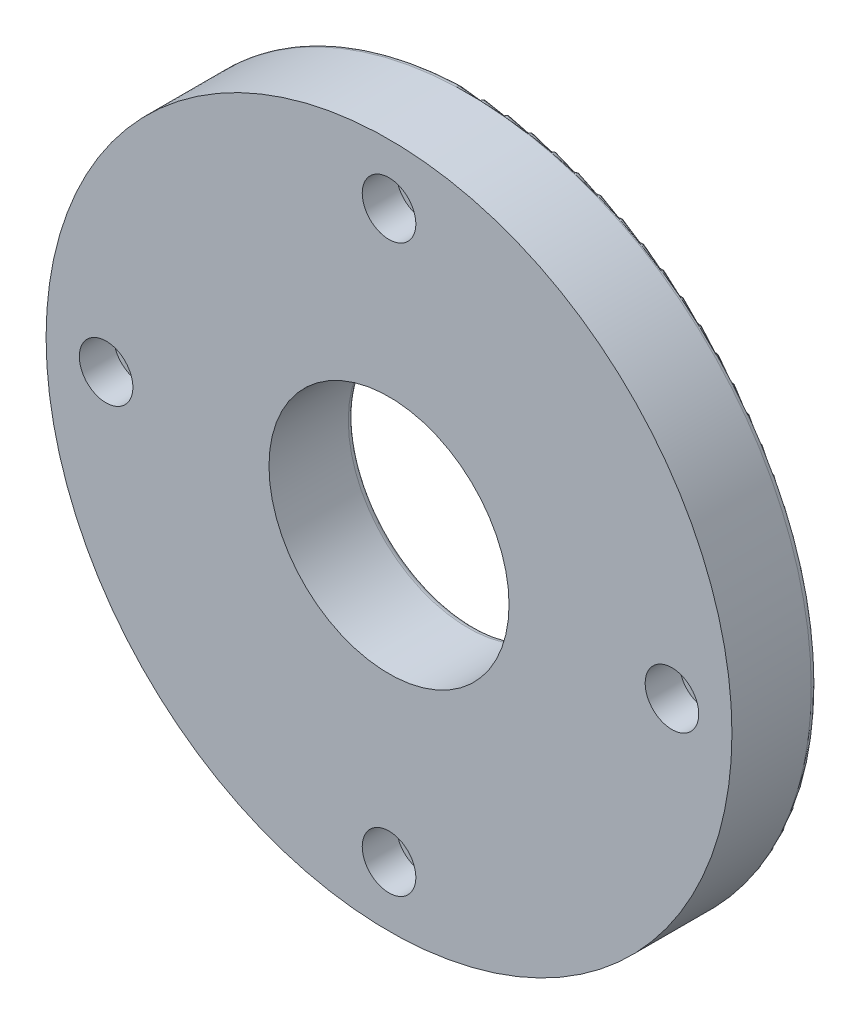
ISO-10303-21;
HEADER;
FILE_DESCRIPTION(('STEP AP214'),'2;1');
FILE_NAME('part.step','',(''),(''),'','','');
FILE_SCHEMA(('AUTOMOTIVE_DESIGN { 1 0 10303 214 1 1 1 1 }'));
ENDSEC;
DATA;
#1=APPLICATION_CONTEXT('core data for automotive mechanical design processes');
#2=APPLICATION_PROTOCOL_DEFINITION('international standard','automotive_design',2000,#1);
#3=PRODUCT_CONTEXT('',#1,'mechanical');
#4=PRODUCT('Part','Part','',(#3));
#5=PRODUCT_RELATED_PRODUCT_CATEGORY('part','',(#4));
#6=PRODUCT_DEFINITION_FORMATION('','',#4);
#7=PRODUCT_DEFINITION_CONTEXT('part definition',#1,'design');
#8=PRODUCT_DEFINITION('design','',#6,#7);
#9=PRODUCT_DEFINITION_SHAPE('','',#8);
#10=(LENGTH_UNIT() NAMED_UNIT(*) SI_UNIT(.MILLI.,.METRE.));
#11=(NAMED_UNIT(*) PLANE_ANGLE_UNIT() SI_UNIT($,.RADIAN.));
#12=(NAMED_UNIT(*) SI_UNIT($,.STERADIAN.) SOLID_ANGLE_UNIT());
#13=UNCERTAINTY_MEASURE_WITH_UNIT(LENGTH_MEASURE(1.E-05),#10,'distance_accuracy_value','');
#14=(GEOMETRIC_REPRESENTATION_CONTEXT(3) GLOBAL_UNCERTAINTY_ASSIGNED_CONTEXT((#13)) GLOBAL_UNIT_ASSIGNED_CONTEXT((#10,
#11,#12)) REPRESENTATION_CONTEXT('',''));
#15=CARTESIAN_POINT('',(0.,0.,0.));
#16=DIRECTION('',(0.,0.,1.));
#17=DIRECTION('',(1.,0.,0.));
#18=AXIS2_PLACEMENT_3D('',#15,#16,#17);
#19=CARTESIAN_POINT('',(0.,0.,10.));
#20=DIRECTION('',(0.,0.,1.));
#21=DIRECTION('',(1.,0.,0.));
#22=AXIS2_PLACEMENT_3D('',#19,#20,#21);
#23=PLANE('',#22);
#24=CARTESIAN_POINT('',(0.,33.,10.));
#25=DIRECTION('',(0.,0.,-1.));
#26=DIRECTION('',(-1.,0.,0.));
#27=AXIS2_PLACEMENT_3D('',#24,#25,#26);
#28=CIRCLE('',#27,3.125);
#29=CARTESIAN_POINT('',(-3.125,33.,10.));
#30=VERTEX_POINT('',#29);
#31=EDGE_CURVE('E116',#30,#30,#28,.T.);
#32=ORIENTED_EDGE('',*,*,#31,.T.);
#33=EDGE_LOOP('',(#32));
#34=FACE_BOUND('',#33,.T.);
#35=CARTESIAN_POINT('',(-33.0000000000009,9.31854409547553E-13,10.));
#36=DIRECTION('',(0.,0.,-1.));
#37=DIRECTION('',(-1.,0.,0.));
#38=AXIS2_PLACEMENT_3D('',#35,#36,#37);
#39=CIRCLE('',#38,3.12500000000073);
#40=CARTESIAN_POINT('',(-36.1250000000017,9.31854409547553E-13,10.));
#41=VERTEX_POINT('',#40);
#42=EDGE_CURVE('E110',#41,#41,#39,.T.);
#43=ORIENTED_EDGE('',*,*,#42,.T.);
#44=EDGE_LOOP('',(#43));
#45=FACE_BOUND('',#44,.T.);
#46=CARTESIAN_POINT('',(-1.86370881909511E-12,-33.,10.));
#47=DIRECTION('',(0.,0.,-1.));
#48=DIRECTION('',(-1.,0.,0.));
#49=AXIS2_PLACEMENT_3D('',#46,#47,#48);
#50=CIRCLE('',#49,3.125000000002);
#51=CARTESIAN_POINT('',(-3.12500000000387,-33.,10.));
#52=VERTEX_POINT('',#51);
#53=EDGE_CURVE('E104',#52,#52,#50,.T.);
#54=ORIENTED_EDGE('',*,*,#53,.T.);
#55=EDGE_LOOP('',(#54));
#56=FACE_BOUND('',#55,.T.);
#57=CARTESIAN_POINT('',(32.9999999999991,-9.35895743984739E-13,10.));
#58=DIRECTION('',(0.,0.,-1.));
#59=DIRECTION('',(-1.,0.,0.));
#60=AXIS2_PLACEMENT_3D('',#57,#58,#59);
#61=CIRCLE('',#60,3.1250000000015);
#62=CARTESIAN_POINT('',(29.8749999999976,-9.35895743984739E-13,10.));
#63=VERTEX_POINT('',#62);
#64=EDGE_CURVE('E98',#63,#63,#61,.T.);
#65=ORIENTED_EDGE('',*,*,#64,.T.);
#66=EDGE_LOOP('',(#65));
#67=FACE_BOUND('',#66,.T.);
#68=CARTESIAN_POINT('',(0.,0.,10.));
#69=DIRECTION('',(0.,0.,1.));
#70=DIRECTION('',(1.,0.,0.));
#71=AXIS2_PLACEMENT_3D('',#68,#69,#70);
#72=CIRCLE('',#71,40.);
#73=CARTESIAN_POINT('',(40.,0.,10.));
#74=VERTEX_POINT('',#73);
#75=EDGE_CURVE('E79',#74,#74,#72,.T.);
#76=ORIENTED_EDGE('',*,*,#75,.T.);
#77=EDGE_LOOP('',(#76));
#78=FACE_BOUND('',#77,.T.);
#79=CARTESIAN_POINT('',(0.,0.,10.));
#80=DIRECTION('',(0.,0.,1.));
#81=DIRECTION('',(1.,0.,0.));
#82=AXIS2_PLACEMENT_3D('',#79,#80,#81);
#83=CIRCLE('',#82,14.);
#84=CARTESIAN_POINT('',(14.,0.,10.));
#85=VERTEX_POINT('',#84);
#86=EDGE_CURVE('E83',#85,#85,#83,.T.);
#87=ORIENTED_EDGE('',*,*,#86,.F.);
#88=EDGE_LOOP('',(#87));
#89=FACE_BOUND('',#88,.T.);
#90=ADVANCED_FACE('F35',(#34,#45,#56,#67,#78,#89),#23,.T.);
#91=CARTESIAN_POINT('',(0.,0.,0.));
#92=DIRECTION('',(0.,0.,1.));
#93=DIRECTION('',(1.,0.,0.));
#94=AXIS2_PLACEMENT_3D('',#91,#92,#93);
#95=PLANE('',#94);
#96=CARTESIAN_POINT('',(0.,0.,0.));
#97=DIRECTION('',(0.,0.,1.));
#98=DIRECTION('',(1.,0.,0.));
#99=AXIS2_PLACEMENT_3D('',#96,#97,#98);
#100=CIRCLE('',#99,14.75);
#101=CARTESIAN_POINT('',(14.75,0.,0.));
#102=VERTEX_POINT('',#101);
#103=EDGE_CURVE('E61',#102,#102,#100,.T.);
#104=ORIENTED_EDGE('',*,*,#103,.T.);
#105=EDGE_LOOP('',(#104));
#106=FACE_BOUND('',#105,.T.);
#107=CARTESIAN_POINT('',(0.,0.,0.));
#108=DIRECTION('',(0.,0.,1.));
#109=DIRECTION('',(1.,0.,0.));
#110=AXIS2_PLACEMENT_3D('',#107,#108,#109);
#111=CIRCLE('',#110,39.25);
#112=CARTESIAN_POINT('',(39.25,0.,0.));
#113=VERTEX_POINT('',#112);
#114=EDGE_CURVE('E64',#113,#113,#111,.F.);
#115=ORIENTED_EDGE('',*,*,#114,.T.);
#116=EDGE_LOOP('',(#115));
#117=FACE_BOUND('',#116,.T.);
#118=CARTESIAN_POINT('',(32.999999999999,-9.92249304125888E-13,0.));
#119=DIRECTION('',(0.,0.,1.));
#120=DIRECTION('',(1.,0.,0.));
#121=AXIS2_PLACEMENT_3D('',#118,#119,#120);
#122=CIRCLE('',#121,2.45);
#123=CARTESIAN_POINT('',(35.449999999999,-9.92249304125888E-13,0.));
#124=VERTEX_POINT('',#123);
#125=EDGE_CURVE('E67',#124,#124,#122,.T.);
#126=ORIENTED_EDGE('',*,*,#125,.T.);
#127=EDGE_LOOP('',(#126));
#128=FACE_BOUND('',#127,.T.);
#129=CARTESIAN_POINT('',(-1.9764159393774E-12,-33.,0.));
#130=DIRECTION('',(0.,0.,1.));
#131=DIRECTION('',(1.,0.,0.));
#132=AXIS2_PLACEMENT_3D('',#129,#130,#131);
#133=CIRCLE('',#132,2.45);
#134=CARTESIAN_POINT('',(2.44999999999802,-33.,0.));
#135=VERTEX_POINT('',#134);
#136=EDGE_CURVE('E70',#135,#135,#133,.T.);
#137=ORIENTED_EDGE('',*,*,#136,.T.);
#138=EDGE_LOOP('',(#137));
#139=FACE_BOUND('',#138,.T.);
#140=CARTESIAN_POINT('',(-33.000000000001,9.88207969688702E-13,0.));
#141=DIRECTION('',(0.,0.,1.));
#142=DIRECTION('',(1.,0.,0.));
#143=AXIS2_PLACEMENT_3D('',#140,#141,#142);
#144=CIRCLE('',#143,2.45);
#145=CARTESIAN_POINT('',(-30.550000000001,9.88207969688702E-13,0.));
#146=VERTEX_POINT('',#145);
#147=EDGE_CURVE('E73',#146,#146,#144,.T.);
#148=ORIENTED_EDGE('',*,*,#147,.T.);
#149=EDGE_LOOP('',(#148));
#150=FACE_BOUND('',#149,.T.);
#151=CARTESIAN_POINT('',(0.,33.,0.));
#152=DIRECTION('',(0.,0.,1.));
#153=DIRECTION('',(1.,0.,0.));
#154=AXIS2_PLACEMENT_3D('',#151,#152,#153);
#155=CIRCLE('',#154,2.45);
#156=CARTESIAN_POINT('',(2.45,33.,0.));
#157=VERTEX_POINT('',#156);
#158=EDGE_CURVE('E76',#157,#157,#155,.T.);
#159=ORIENTED_EDGE('',*,*,#158,.T.);
#160=EDGE_LOOP('',(#159));
#161=FACE_BOUND('',#160,.T.);
#162=ADVANCED_FACE('F142',(#106,#117,#128,#139,#150,#161),#95,.F.);
#163=CARTESIAN_POINT('',(0.,0.,10.));
#164=DIRECTION('',(0.,0.,-1.));
#165=DIRECTION('',(-1.,0.,0.));
#166=AXIS2_PLACEMENT_3D('',#163,#164,#165);
#167=CYLINDRICAL_SURFACE('',#166,40.);
#168=CARTESIAN_POINT('',(0.,0.,0.750000000000001));
#169=DIRECTION('',(0.,0.,1.));
#170=DIRECTION('',(1.,0.,0.));
#171=AXIS2_PLACEMENT_3D('',#168,#169,#170);
#172=CIRCLE('',#171,40.);
#173=CARTESIAN_POINT('',(40.,0.,0.750000000000001));
#174=VERTEX_POINT('',#173);
#175=EDGE_CURVE('E55',#174,#174,#172,.T.);
#176=ORIENTED_EDGE('',*,*,#175,.T.);
#177=EDGE_LOOP('',(#176));
#178=FACE_BOUND('',#177,.T.);
#179=ORIENTED_EDGE('',*,*,#75,.F.);
#180=EDGE_LOOP('',(#179));
#181=FACE_BOUND('',#180,.T.);
#182=ADVANCED_FACE('F148',(#178,#181),#167,.T.);
#183=CARTESIAN_POINT('',(0.,0.,10.));
#184=DIRECTION('',(0.,0.,-1.));
#185=DIRECTION('',(-1.,0.,0.));
#186=AXIS2_PLACEMENT_3D('',#183,#184,#185);
#187=CYLINDRICAL_SURFACE('',#186,14.);
#188=CARTESIAN_POINT('',(0.,0.,0.750000000000001));
#189=DIRECTION('',(0.,0.,1.));
#190=DIRECTION('',(1.,0.,0.));
#191=AXIS2_PLACEMENT_3D('',#188,#189,#190);
#192=CIRCLE('',#191,14.);
#193=CARTESIAN_POINT('',(14.,0.,0.750000000000001));
#194=VERTEX_POINT('',#193);
#195=EDGE_CURVE('E58',#194,#194,#192,.F.);
#196=ORIENTED_EDGE('',*,*,#195,.T.);
#197=EDGE_LOOP('',(#196));
#198=FACE_BOUND('',#197,.T.);
#199=ORIENTED_EDGE('',*,*,#86,.T.);
#200=EDGE_LOOP('',(#199));
#201=FACE_BOUND('',#200,.T.);
#202=ADVANCED_FACE('F153',(#198,#201),#187,.F.);
#203=CARTESIAN_POINT('',(32.999999999999,-9.92249304125888E-13,10.));
#204=DIRECTION('',(0.,0.,-1.));
#205=DIRECTION('',(-1.,0.,0.));
#206=AXIS2_PLACEMENT_3D('',#203,#204,#205);
#207=CYLINDRICAL_SURFACE('',#206,1.7);
#208=CARTESIAN_POINT('',(32.999999999999,-9.92249304125888E-13,0.750000000000001));
#209=DIRECTION('',(0.,0.,1.));
#210=DIRECTION('',(1.,0.,0.));
#211=AXIS2_PLACEMENT_3D('',#208,#209,#210);
#212=CIRCLE('',#211,1.7);
#213=CARTESIAN_POINT('',(34.699999999999,-9.92249304125888E-13,0.750000000000001));
#214=VERTEX_POINT('',#213);
#215=EDGE_CURVE('E50',#214,#214,#212,.F.);
#216=ORIENTED_EDGE('',*,*,#215,.T.);
#217=EDGE_LOOP('',(#216));
#218=FACE_BOUND('',#217,.T.);
#219=CARTESIAN_POINT('',(32.999999999999,-9.92249304125888E-13,6.));
#220=DIRECTION('',(0.,0.,-1.));
#221=DIRECTION('',(-1.,0.,0.));
#222=AXIS2_PLACEMENT_3D('',#219,#220,#221);
#223=CIRCLE('',#222,1.7);
#224=CARTESIAN_POINT('',(31.299999999999,-9.92249304125888E-13,6.));
#225=VERTEX_POINT('',#224);
#226=EDGE_CURVE('E80',#225,#225,#223,.F.);
#227=ORIENTED_EDGE('',*,*,#226,.T.);
#228=EDGE_LOOP('',(#227));
#229=FACE_BOUND('',#228,.T.);
#230=ADVANCED_FACE('F240',(#218,#229),#207,.F.);
#231=CARTESIAN_POINT('',(-1.9764159393774E-12,-33.,10.));
#232=DIRECTION('',(0.,0.,-1.));
#233=DIRECTION('',(-1.,0.,0.));
#234=AXIS2_PLACEMENT_3D('',#231,#232,#233);
#235=CYLINDRICAL_SURFACE('',#234,1.7);
#236=CARTESIAN_POINT('',(-1.9764159393774E-12,-33.,0.750000000000001));
#237=DIRECTION('',(0.,0.,1.));
#238=DIRECTION('',(1.,0.,0.));
#239=AXIS2_PLACEMENT_3D('',#236,#237,#238);
#240=CIRCLE('',#239,1.7);
#241=CARTESIAN_POINT('',(1.69999999999802,-33.,0.750000000000001));
#242=VERTEX_POINT('',#241);
#243=EDGE_CURVE('E46',#242,#242,#240,.F.);
#244=ORIENTED_EDGE('',*,*,#243,.T.);
#245=EDGE_LOOP('',(#244));
#246=FACE_BOUND('',#245,.T.);
#247=CARTESIAN_POINT('',(-1.9764159393774E-12,-33.,6.));
#248=DIRECTION('',(0.,0.,-1.));
#249=DIRECTION('',(-1.,0.,0.));
#250=AXIS2_PLACEMENT_3D('',#247,#248,#249);
#251=CIRCLE('',#250,1.7);
#252=CARTESIAN_POINT('',(-1.70000000000198,-33.,6.));
#253=VERTEX_POINT('',#252);
#254=EDGE_CURVE('E84',#253,#253,#251,.F.);
#255=ORIENTED_EDGE('',*,*,#254,.T.);
#256=EDGE_LOOP('',(#255));
#257=FACE_BOUND('',#256,.T.);
#258=ADVANCED_FACE('F138',(#246,#257),#235,.F.);
#259=CARTESIAN_POINT('',(-33.000000000001,9.88207969688702E-13,10.));
#260=DIRECTION('',(0.,0.,-1.));
#261=DIRECTION('',(-1.,0.,0.));
#262=AXIS2_PLACEMENT_3D('',#259,#260,#261);
#263=CYLINDRICAL_SURFACE('',#262,1.7);
#264=CARTESIAN_POINT('',(-33.000000000001,9.88207969688702E-13,0.750000000000001));
#265=DIRECTION('',(0.,0.,1.));
#266=DIRECTION('',(1.,0.,0.));
#267=AXIS2_PLACEMENT_3D('',#264,#265,#266);
#268=CIRCLE('',#267,1.7);
#269=CARTESIAN_POINT('',(-31.300000000001,9.88207969688702E-13,0.750000000000001));
#270=VERTEX_POINT('',#269);
#271=EDGE_CURVE('E42',#270,#270,#268,.F.);
#272=ORIENTED_EDGE('',*,*,#271,.T.);
#273=EDGE_LOOP('',(#272));
#274=FACE_BOUND('',#273,.T.);
#275=CARTESIAN_POINT('',(-33.000000000001,9.88207969688702E-13,6.));
#276=DIRECTION('',(0.,0.,-1.));
#277=DIRECTION('',(-1.,0.,0.));
#278=AXIS2_PLACEMENT_3D('',#275,#276,#277);
#279=CIRCLE('',#278,1.7);
#280=CARTESIAN_POINT('',(-34.700000000001,9.88207969688702E-13,6.));
#281=VERTEX_POINT('',#280);
#282=EDGE_CURVE('E87',#281,#281,#279,.F.);
#283=ORIENTED_EDGE('',*,*,#282,.T.);
#284=EDGE_LOOP('',(#283));
#285=FACE_BOUND('',#284,.T.);
#286=ADVANCED_FACE('F133',(#274,#285),#263,.F.);
#287=CARTESIAN_POINT('',(0.,33.,10.));
#288=DIRECTION('',(0.,0.,-1.));
#289=DIRECTION('',(-1.,0.,0.));
#290=AXIS2_PLACEMENT_3D('',#287,#288,#289);
#291=CYLINDRICAL_SURFACE('',#290,1.7);
#292=CARTESIAN_POINT('',(0.,33.,0.750000000000001));
#293=DIRECTION('',(0.,0.,1.));
#294=DIRECTION('',(1.,0.,0.));
#295=AXIS2_PLACEMENT_3D('',#292,#293,#294);
#296=CIRCLE('',#295,1.7);
#297=CARTESIAN_POINT('',(1.7,33.,0.750000000000001));
#298=VERTEX_POINT('',#297);
#299=EDGE_CURVE('E10',#298,#298,#296,.F.);
#300=ORIENTED_EDGE('',*,*,#299,.T.);
#301=EDGE_LOOP('',(#300));
#302=FACE_BOUND('',#301,.T.);
#303=CARTESIAN_POINT('',(0.,33.,6.));
#304=DIRECTION('',(0.,0.,-1.));
#305=DIRECTION('',(-1.,0.,0.));
#306=AXIS2_PLACEMENT_3D('',#303,#304,#305);
#307=CIRCLE('',#306,1.7);
#308=CARTESIAN_POINT('',(-1.7,33.,6.));
#309=VERTEX_POINT('',#308);
#310=EDGE_CURVE('E90',#309,#309,#307,.F.);
#311=ORIENTED_EDGE('',*,*,#310,.T.);
#312=EDGE_LOOP('',(#311));
#313=FACE_BOUND('',#312,.T.);
#314=ADVANCED_FACE('F128',(#302,#313),#291,.F.);
#315=CARTESIAN_POINT('',(0.,33.,6.));
#316=DIRECTION('',(0.,0.,-1.));
#317=DIRECTION('',(-1.,0.,0.));
#318=AXIS2_PLACEMENT_3D('',#315,#316,#317);
#319=PLANE('',#318);
#320=CARTESIAN_POINT('',(0.,33.,6.));
#321=DIRECTION('',(0.,0.,-1.));
#322=DIRECTION('',(-1.,0.,0.));
#323=AXIS2_PLACEMENT_3D('',#320,#321,#322);
#324=CIRCLE('',#323,3.125);
#325=CARTESIAN_POINT('',(-3.125,33.,6.));
#326=VERTEX_POINT('',#325);
#327=EDGE_CURVE('E93',#326,#326,#324,.T.);
#328=ORIENTED_EDGE('',*,*,#327,.F.);
#329=EDGE_LOOP('',(#328));
#330=FACE_BOUND('',#329,.T.);
#331=ORIENTED_EDGE('',*,*,#310,.F.);
#332=EDGE_LOOP('',(#331));
#333=FACE_BOUND('',#332,.T.);
#334=ADVANCED_FACE('F125',(#330,#333),#319,.F.);
#335=CARTESIAN_POINT('',(0.,33.,6.));
#336=DIRECTION('',(0.,0.,1.));
#337=DIRECTION('',(1.,0.,0.));
#338=AXIS2_PLACEMENT_3D('',#335,#336,#337);
#339=CYLINDRICAL_SURFACE('',#338,3.125);
#340=ORIENTED_EDGE('',*,*,#327,.T.);
#341=EDGE_LOOP('',(#340));
#342=FACE_BOUND('',#341,.T.);
#343=ORIENTED_EDGE('',*,*,#31,.F.);
#344=EDGE_LOOP('',(#343));
#345=FACE_BOUND('',#344,.T.);
#346=ADVANCED_FACE('F122',(#342,#345),#339,.F.);
#347=CARTESIAN_POINT('',(-33.0000000000009,9.31854409547553E-13,6.));
#348=DIRECTION('',(0.,0.,-1.));
#349=DIRECTION('',(-1.,0.,0.));
#350=AXIS2_PLACEMENT_3D('',#347,#348,#349);
#351=PLANE('',#350);
#352=CARTESIAN_POINT('',(-33.0000000000009,9.31854409547553E-13,6.));
#353=DIRECTION('',(0.,0.,-1.));
#354=DIRECTION('',(-1.,0.,0.));
#355=AXIS2_PLACEMENT_3D('',#352,#353,#354);
#356=CIRCLE('',#355,3.12500000000073);
#357=CARTESIAN_POINT('',(-36.1250000000017,9.31854409547553E-13,6.));
#358=VERTEX_POINT('',#357);
#359=EDGE_CURVE('E113',#358,#358,#356,.T.);
#360=ORIENTED_EDGE('',*,*,#359,.F.);
#361=EDGE_LOOP('',(#360));
#362=FACE_BOUND('',#361,.T.);
#363=ORIENTED_EDGE('',*,*,#282,.F.);
#364=EDGE_LOOP('',(#363));
#365=FACE_BOUND('',#364,.T.);
#366=ADVANCED_FACE('F316',(#362,#365),#351,.F.);
#367=CARTESIAN_POINT('',(-33.0000000000009,9.31854409547553E-13,6.));
#368=DIRECTION('',(0.,0.,1.));
#369=DIRECTION('',(1.,0.,0.));
#370=AXIS2_PLACEMENT_3D('',#367,#368,#369);
#371=CYLINDRICAL_SURFACE('',#370,3.12500000000073);
#372=ORIENTED_EDGE('',*,*,#359,.T.);
#373=EDGE_LOOP('',(#372));
#374=FACE_BOUND('',#373,.T.);
#375=ORIENTED_EDGE('',*,*,#42,.F.);
#376=EDGE_LOOP('',(#375));
#377=FACE_BOUND('',#376,.T.);
#378=ADVANCED_FACE('F306',(#374,#377),#371,.F.);
#379=CARTESIAN_POINT('',(-1.86370881909511E-12,-33.,6.));
#380=DIRECTION('',(0.,0.,-1.));
#381=DIRECTION('',(-1.,0.,0.));
#382=AXIS2_PLACEMENT_3D('',#379,#380,#381);
#383=PLANE('',#382);
#384=CARTESIAN_POINT('',(-1.86370881909511E-12,-33.,6.));
#385=DIRECTION('',(0.,0.,-1.));
#386=DIRECTION('',(-1.,0.,0.));
#387=AXIS2_PLACEMENT_3D('',#384,#385,#386);
#388=CIRCLE('',#387,3.125000000002);
#389=CARTESIAN_POINT('',(-3.12500000000387,-33.,6.));
#390=VERTEX_POINT('',#389);
#391=EDGE_CURVE('E107',#390,#390,#388,.T.);
#392=ORIENTED_EDGE('',*,*,#391,.F.);
#393=EDGE_LOOP('',(#392));
#394=FACE_BOUND('',#393,.T.);
#395=ORIENTED_EDGE('',*,*,#254,.F.);
#396=EDGE_LOOP('',(#395));
#397=FACE_BOUND('',#396,.T.);
#398=ADVANCED_FACE('F296',(#394,#397),#383,.F.);
#399=CARTESIAN_POINT('',(-1.86370881909511E-12,-33.,6.));
#400=DIRECTION('',(0.,0.,1.));
#401=DIRECTION('',(1.,0.,0.));
#402=AXIS2_PLACEMENT_3D('',#399,#400,#401);
#403=CYLINDRICAL_SURFACE('',#402,3.125000000002);
#404=ORIENTED_EDGE('',*,*,#391,.T.);
#405=EDGE_LOOP('',(#404));
#406=FACE_BOUND('',#405,.T.);
#407=ORIENTED_EDGE('',*,*,#53,.F.);
#408=EDGE_LOOP('',(#407));
#409=FACE_BOUND('',#408,.T.);
#410=ADVANCED_FACE('F286',(#406,#409),#403,.F.);
#411=CARTESIAN_POINT('',(32.9999999999991,-9.35895743984739E-13,6.));
#412=DIRECTION('',(0.,0.,-1.));
#413=DIRECTION('',(-1.,0.,0.));
#414=AXIS2_PLACEMENT_3D('',#411,#412,#413);
#415=PLANE('',#414);
#416=CARTESIAN_POINT('',(32.9999999999991,-9.35895743984739E-13,6.));
#417=DIRECTION('',(0.,0.,-1.));
#418=DIRECTION('',(-1.,0.,0.));
#419=AXIS2_PLACEMENT_3D('',#416,#417,#418);
#420=CIRCLE('',#419,3.1250000000015);
#421=CARTESIAN_POINT('',(29.8749999999976,-9.35895743984739E-13,6.));
#422=VERTEX_POINT('',#421);
#423=EDGE_CURVE('E101',#422,#422,#420,.T.);
#424=ORIENTED_EDGE('',*,*,#423,.F.);
#425=EDGE_LOOP('',(#424));
#426=FACE_BOUND('',#425,.T.);
#427=ORIENTED_EDGE('',*,*,#226,.F.);
#428=EDGE_LOOP('',(#427));
#429=FACE_BOUND('',#428,.T.);
#430=ADVANCED_FACE('F277',(#426,#429),#415,.F.);
#431=CARTESIAN_POINT('',(32.9999999999991,-9.35895743984739E-13,6.));
#432=DIRECTION('',(0.,0.,1.));
#433=DIRECTION('',(1.,0.,0.));
#434=AXIS2_PLACEMENT_3D('',#431,#432,#433);
#435=CYLINDRICAL_SURFACE('',#434,3.1250000000015);
#436=ORIENTED_EDGE('',*,*,#423,.T.);
#437=EDGE_LOOP('',(#436));
#438=FACE_BOUND('',#437,.T.);
#439=ORIENTED_EDGE('',*,*,#64,.F.);
#440=EDGE_LOOP('',(#439));
#441=FACE_BOUND('',#440,.T.);
#442=ADVANCED_FACE('F163',(#438,#441),#435,.F.);
#443=CARTESIAN_POINT('',(0.,0.,0.750000000000001));
#444=DIRECTION('',(0.,0.,1.));
#445=DIRECTION('',(1.,0.,0.));
#446=AXIS2_PLACEMENT_3D('',#443,#444,#445);
#447=TOROIDAL_SURFACE('',#446,14.75,0.75);
#448=ORIENTED_EDGE('',*,*,#195,.F.);
#449=EDGE_LOOP('',(#448));
#450=FACE_BOUND('',#449,.T.);
#451=ORIENTED_EDGE('',*,*,#103,.F.);
#452=EDGE_LOOP('',(#451));
#453=FACE_BOUND('',#452,.T.);
#454=ADVANCED_FACE('F159',(#450,#453),#447,.T.);
#455=CARTESIAN_POINT('',(0.,0.,0.750000000000001));
#456=DIRECTION('',(0.,0.,1.));
#457=DIRECTION('',(1.,0.,0.));
#458=AXIS2_PLACEMENT_3D('',#455,#456,#457);
#459=TOROIDAL_SURFACE('',#458,39.25,0.75);
#460=ORIENTED_EDGE('',*,*,#114,.F.);
#461=EDGE_LOOP('',(#460));
#462=FACE_BOUND('',#461,.T.);
#463=ORIENTED_EDGE('',*,*,#175,.F.);
#464=EDGE_LOOP('',(#463));
#465=FACE_BOUND('',#464,.T.);
#466=ADVANCED_FACE('F162',(#462,#465),#459,.T.);
#467=CARTESIAN_POINT('',(32.999999999999,-9.92249304125888E-13,0.750000000000001));
#468=DIRECTION('',(0.,0.,1.));
#469=DIRECTION('',(1.,0.,0.));
#470=AXIS2_PLACEMENT_3D('',#467,#468,#469);
#471=TOROIDAL_SURFACE('',#470,2.45,0.75);
#472=ORIENTED_EDGE('',*,*,#125,.F.);
#473=EDGE_LOOP('',(#472));
#474=FACE_BOUND('',#473,.T.);
#475=ORIENTED_EDGE('',*,*,#215,.F.);
#476=EDGE_LOOP('',(#475));
#477=FACE_BOUND('',#476,.T.);
#478=ADVANCED_FACE('F167',(#474,#477),#471,.T.);
#479=CARTESIAN_POINT('',(-1.9764159393774E-12,-33.,0.750000000000001));
#480=DIRECTION('',(0.,0.,1.));
#481=DIRECTION('',(1.,0.,0.));
#482=AXIS2_PLACEMENT_3D('',#479,#480,#481);
#483=TOROIDAL_SURFACE('',#482,2.45,0.75);
#484=ORIENTED_EDGE('',*,*,#136,.F.);
#485=EDGE_LOOP('',(#484));
#486=FACE_BOUND('',#485,.T.);
#487=ORIENTED_EDGE('',*,*,#243,.F.);
#488=EDGE_LOOP('',(#487));
#489=FACE_BOUND('',#488,.T.);
#490=ADVANCED_FACE('F171',(#486,#489),#483,.T.);
#491=CARTESIAN_POINT('',(-33.000000000001,9.88207969688702E-13,0.750000000000001));
#492=DIRECTION('',(0.,0.,1.));
#493=DIRECTION('',(1.,0.,0.));
#494=AXIS2_PLACEMENT_3D('',#491,#492,#493);
#495=TOROIDAL_SURFACE('',#494,2.45,0.75);
#496=ORIENTED_EDGE('',*,*,#147,.F.);
#497=EDGE_LOOP('',(#496));
#498=FACE_BOUND('',#497,.T.);
#499=ORIENTED_EDGE('',*,*,#271,.F.);
#500=EDGE_LOOP('',(#499));
#501=FACE_BOUND('',#500,.T.);
#502=ADVANCED_FACE('F174',(#498,#501),#495,.T.);
#503=CARTESIAN_POINT('',(0.,33.,0.750000000000001));
#504=DIRECTION('',(0.,0.,1.));
#505=DIRECTION('',(1.,0.,0.));
#506=AXIS2_PLACEMENT_3D('',#503,#504,#505);
#507=TOROIDAL_SURFACE('',#506,2.45,0.75);
#508=ORIENTED_EDGE('',*,*,#158,.F.);
#509=EDGE_LOOP('',(#508));
#510=FACE_BOUND('',#509,.T.);
#511=ORIENTED_EDGE('',*,*,#299,.F.);
#512=EDGE_LOOP('',(#511));
#513=FACE_BOUND('',#512,.T.);
#514=ADVANCED_FACE('F37',(#510,#513),#507,.T.);
#515=CLOSED_SHELL('',(#90,#162,#182,#202,#230,#258,#286,#314,#334,#346,#366,#378,#398,#410,#430,
#442,#454,#466,#478,#490,#502,#514));
#516=MANIFOLD_SOLID_BREP('B2',#515);
#517=ADVANCED_BREP_SHAPE_REPRESENTATION('',(#18,#516),#14);
#518=SHAPE_DEFINITION_REPRESENTATION(#9,#517);
ENDSEC;
END-ISO-10303-21;
